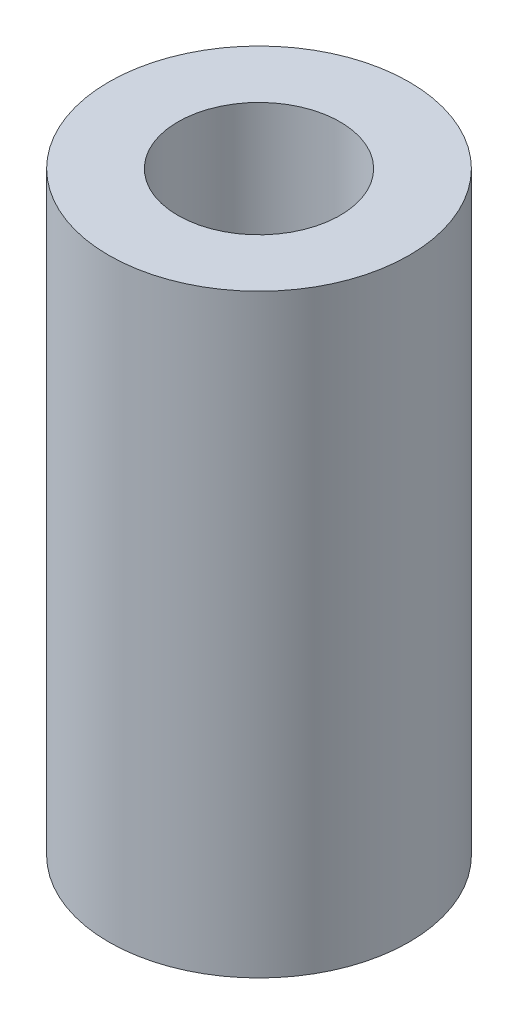
ISO-10303-21;
HEADER;
FILE_DESCRIPTION(('STEP AP214'),'2;1');
FILE_NAME('part.step','',(''),(''),'','','');
FILE_SCHEMA(('AUTOMOTIVE_DESIGN { 1 0 10303 214 1 1 1 1 }'));
ENDSEC;
DATA;
#1=APPLICATION_CONTEXT('core data for automotive mechanical design processes');
#2=APPLICATION_PROTOCOL_DEFINITION('international standard','automotive_design',2000,#1);
#3=PRODUCT_CONTEXT('',#1,'mechanical');
#4=PRODUCT('Part','Part','',(#3));
#5=PRODUCT_RELATED_PRODUCT_CATEGORY('part','',(#4));
#6=PRODUCT_DEFINITION_FORMATION('','',#4);
#7=PRODUCT_DEFINITION_CONTEXT('part definition',#1,'design');
#8=PRODUCT_DEFINITION('design','',#6,#7);
#9=PRODUCT_DEFINITION_SHAPE('','',#8);
#10=(LENGTH_UNIT() NAMED_UNIT(*) SI_UNIT(.MILLI.,.METRE.));
#11=(NAMED_UNIT(*) PLANE_ANGLE_UNIT() SI_UNIT($,.RADIAN.));
#12=(NAMED_UNIT(*) SI_UNIT($,.STERADIAN.) SOLID_ANGLE_UNIT());
#13=UNCERTAINTY_MEASURE_WITH_UNIT(LENGTH_MEASURE(1.E-05),#10,'distance_accuracy_value','');
#14=(GEOMETRIC_REPRESENTATION_CONTEXT(3) GLOBAL_UNCERTAINTY_ASSIGNED_CONTEXT((#13)) GLOBAL_UNIT_ASSIGNED_CONTEXT((#10,
#11,#12)) REPRESENTATION_CONTEXT('',''));
#15=CARTESIAN_POINT('',(0.,0.,0.));
#16=DIRECTION('',(0.,0.,1.));
#17=DIRECTION('',(1.,0.,0.));
#18=AXIS2_PLACEMENT_3D('',#15,#16,#17);
#19=CARTESIAN_POINT('',(0.,25.146,0.));
#20=DIRECTION('',(0.,1.,0.));
#21=DIRECTION('',(0.,0.,1.));
#22=AXIS2_PLACEMENT_3D('',#19,#20,#21);
#23=PLANE('',#22);
#24=CARTESIAN_POINT('',(0.,25.146,0.));
#25=DIRECTION('',(0.,1.,0.));
#26=DIRECTION('',(0.,0.,1.));
#27=AXIS2_PLACEMENT_3D('',#24,#25,#26);
#28=CIRCLE('',#27,6.35);
#29=CARTESIAN_POINT('',(0.,25.146,6.35));
#30=VERTEX_POINT('',#29);
#31=EDGE_CURVE('E10',#30,#30,#28,.T.);
#32=ORIENTED_EDGE('',*,*,#31,.T.);
#33=EDGE_LOOP('',(#32));
#34=FACE_BOUND('',#33,.T.);
#35=CARTESIAN_POINT('',(0.,25.146,0.));
#36=DIRECTION('',(0.,1.,0.));
#37=DIRECTION('',(0.,0.,1.));
#38=AXIS2_PLACEMENT_3D('',#35,#36,#37);
#39=CIRCLE('',#38,3.429);
#40=CARTESIAN_POINT('',(0.,25.146,3.429));
#41=VERTEX_POINT('',#40);
#42=EDGE_CURVE('E54',#41,#41,#39,.T.);
#43=ORIENTED_EDGE('',*,*,#42,.F.);
#44=EDGE_LOOP('',(#43));
#45=FACE_BOUND('',#44,.T.);
#46=ADVANCED_FACE('F41',(#34,#45),#23,.T.);
#47=CARTESIAN_POINT('',(0.,0.,0.));
#48=DIRECTION('',(0.,1.,0.));
#49=DIRECTION('',(0.,0.,1.));
#50=AXIS2_PLACEMENT_3D('',#47,#48,#49);
#51=PLANE('',#50);
#52=CARTESIAN_POINT('',(0.,0.,0.));
#53=DIRECTION('',(0.,1.,0.));
#54=DIRECTION('',(0.,0.,1.));
#55=AXIS2_PLACEMENT_3D('',#52,#53,#54);
#56=CIRCLE('',#55,6.35);
#57=CARTESIAN_POINT('',(0.,0.,6.35));
#58=VERTEX_POINT('',#57);
#59=EDGE_CURVE('E45',#58,#58,#56,.T.);
#60=ORIENTED_EDGE('',*,*,#59,.F.);
#61=EDGE_LOOP('',(#60));
#62=FACE_BOUND('',#61,.T.);
#63=CARTESIAN_POINT('',(0.,0.,0.));
#64=DIRECTION('',(0.,1.,0.));
#65=DIRECTION('',(0.,0.,1.));
#66=AXIS2_PLACEMENT_3D('',#63,#64,#65);
#67=CIRCLE('',#66,3.429);
#68=CARTESIAN_POINT('',(0.,0.,3.429));
#69=VERTEX_POINT('',#68);
#70=EDGE_CURVE('E56',#69,#69,#67,.T.);
#71=ORIENTED_EDGE('',*,*,#70,.T.);
#72=EDGE_LOOP('',(#71));
#73=FACE_BOUND('',#72,.T.);
#74=ADVANCED_FACE('F68',(#62,#73),#51,.F.);
#75=CARTESIAN_POINT('',(0.,25.146,0.));
#76=DIRECTION('',(0.,-1.,0.));
#77=DIRECTION('',(0.,0.,-1.));
#78=AXIS2_PLACEMENT_3D('',#75,#76,#77);
#79=CYLINDRICAL_SURFACE('',#78,6.35);
#80=ORIENTED_EDGE('',*,*,#31,.F.);
#81=EDGE_LOOP('',(#80));
#82=FACE_BOUND('',#81,.T.);
#83=ORIENTED_EDGE('',*,*,#59,.T.);
#84=EDGE_LOOP('',(#83));
#85=FACE_BOUND('',#84,.T.);
#86=ADVANCED_FACE('F43',(#82,#85),#79,.T.);
#87=CARTESIAN_POINT('',(0.,25.146,0.));
#88=DIRECTION('',(0.,-1.,0.));
#89=DIRECTION('',(0.,0.,-1.));
#90=AXIS2_PLACEMENT_3D('',#87,#88,#89);
#91=CYLINDRICAL_SURFACE('',#90,3.429);
#92=ORIENTED_EDGE('',*,*,#42,.T.);
#93=EDGE_LOOP('',(#92));
#94=FACE_BOUND('',#93,.T.);
#95=ORIENTED_EDGE('',*,*,#70,.F.);
#96=EDGE_LOOP('',(#95));
#97=FACE_BOUND('',#96,.T.);
#98=ADVANCED_FACE('F64',(#94,#97),#91,.F.);
#99=CLOSED_SHELL('',(#46,#74,#86,#98));
#100=MANIFOLD_SOLID_BREP('B2',#99);
#101=ADVANCED_BREP_SHAPE_REPRESENTATION('',(#18,#100),#14);
#102=SHAPE_DEFINITION_REPRESENTATION(#9,#101);
ENDSEC;
END-ISO-10303-21;
